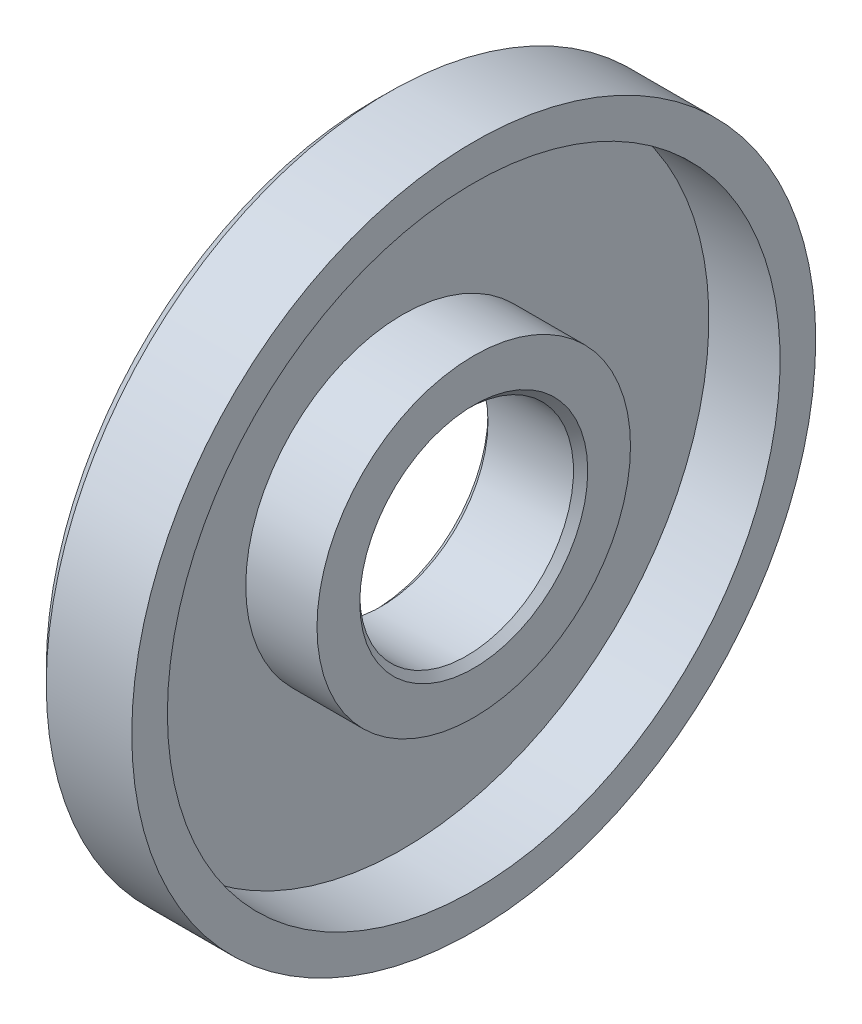
ISO-10303-21;
HEADER;
FILE_DESCRIPTION(('STEP AP214'),'2;1');
FILE_NAME('part.step','',(''),(''),'','','');
FILE_SCHEMA(('AUTOMOTIVE_DESIGN { 1 0 10303 214 1 1 1 1 }'));
ENDSEC;
DATA;
#1=APPLICATION_CONTEXT('core data for automotive mechanical design processes');
#2=APPLICATION_PROTOCOL_DEFINITION('international standard','automotive_design',2000,#1);
#3=PRODUCT_CONTEXT('',#1,'mechanical');
#4=PRODUCT('Part','Part','',(#3));
#5=PRODUCT_RELATED_PRODUCT_CATEGORY('part','',(#4));
#6=PRODUCT_DEFINITION_FORMATION('','',#4);
#7=PRODUCT_DEFINITION_CONTEXT('part definition',#1,'design');
#8=PRODUCT_DEFINITION('design','',#6,#7);
#9=PRODUCT_DEFINITION_SHAPE('','',#8);
#10=(LENGTH_UNIT() NAMED_UNIT(*) SI_UNIT(.MILLI.,.METRE.));
#11=(NAMED_UNIT(*) PLANE_ANGLE_UNIT() SI_UNIT($,.RADIAN.));
#12=(NAMED_UNIT(*) SI_UNIT($,.STERADIAN.) SOLID_ANGLE_UNIT());
#13=UNCERTAINTY_MEASURE_WITH_UNIT(LENGTH_MEASURE(1.E-05),#10,'distance_accuracy_value','');
#14=(GEOMETRIC_REPRESENTATION_CONTEXT(3) GLOBAL_UNCERTAINTY_ASSIGNED_CONTEXT((#13)) GLOBAL_UNIT_ASSIGNED_CONTEXT((#10,
#11,#12)) REPRESENTATION_CONTEXT('',''));
#15=CARTESIAN_POINT('',(0.,0.,0.));
#16=DIRECTION('',(0.,0.,1.));
#17=DIRECTION('',(1.,0.,0.));
#18=AXIS2_PLACEMENT_3D('',#15,#16,#17);
#19=CARTESIAN_POINT('',(0.,0.,0.));
#20=DIRECTION('',(-1.,0.,0.));
#21=DIRECTION('',(0.,0.,1.));
#22=AXIS2_PLACEMENT_3D('',#19,#20,#21);
#23=CYLINDRICAL_SURFACE('',#22,24.);
#24=CARTESIAN_POINT('',(0.999999999999997,0.,0.));
#25=DIRECTION('',(1.,0.,0.));
#26=DIRECTION('',(0.,0.,-1.));
#27=AXIS2_PLACEMENT_3D('',#24,#25,#26);
#28=CIRCLE('',#27,24.);
#29=CARTESIAN_POINT('',(0.999999999999997,0.,-24.));
#30=VERTEX_POINT('',#29);
#31=EDGE_CURVE('E55',#30,#30,#28,.T.);
#32=ORIENTED_EDGE('',*,*,#31,.T.);
#33=EDGE_LOOP('',(#32));
#34=FACE_BOUND('',#33,.T.);
#35=CARTESIAN_POINT('',(7.,0.,0.));
#36=DIRECTION('',(-1.,0.,0.));
#37=DIRECTION('',(0.,0.,1.));
#38=AXIS2_PLACEMENT_3D('',#35,#36,#37);
#39=CIRCLE('',#38,24.);
#40=CARTESIAN_POINT('',(7.,0.,24.));
#41=VERTEX_POINT('',#40);
#42=EDGE_CURVE('E73',#41,#41,#39,.T.);
#43=ORIENTED_EDGE('',*,*,#42,.T.);
#44=EDGE_LOOP('',(#43));
#45=FACE_BOUND('',#44,.T.);
#46=ADVANCED_FACE('F35',(#34,#45),#23,.T.);
#47=CARTESIAN_POINT('',(0.,7.5,0.));
#48=DIRECTION('',(1.,0.,0.));
#49=DIRECTION('',(0.,0.,-1.));
#50=AXIS2_PLACEMENT_3D('',#47,#48,#49);
#51=PLANE('',#50);
#52=CARTESIAN_POINT('',(0.,0.,0.));
#53=DIRECTION('',(1.,0.,0.));
#54=DIRECTION('',(0.,0.,-1.));
#55=AXIS2_PLACEMENT_3D('',#52,#53,#54);
#56=CIRCLE('',#55,8.00000000000001);
#57=CARTESIAN_POINT('',(0.,0.,-8.00000000000001));
#58=VERTEX_POINT('',#57);
#59=EDGE_CURVE('E42',#58,#58,#56,.T.);
#60=ORIENTED_EDGE('',*,*,#59,.T.);
#61=EDGE_LOOP('',(#60));
#62=FACE_BOUND('',#61,.T.);
#63=CARTESIAN_POINT('',(0.,0.,0.));
#64=DIRECTION('',(1.,0.,0.));
#65=DIRECTION('',(0.,0.,-1.));
#66=AXIS2_PLACEMENT_3D('',#63,#64,#65);
#67=CIRCLE('',#66,23.);
#68=CARTESIAN_POINT('',(0.,0.,-23.));
#69=VERTEX_POINT('',#68);
#70=EDGE_CURVE('E58',#69,#69,#67,.F.);
#71=ORIENTED_EDGE('',*,*,#70,.T.);
#72=EDGE_LOOP('',(#71));
#73=FACE_BOUND('',#72,.T.);
#74=ADVANCED_FACE('F110',(#62,#73),#51,.F.);
#75=CARTESIAN_POINT('',(0.,0.,0.));
#76=DIRECTION('',(-1.,0.,0.));
#77=DIRECTION('',(0.,0.,1.));
#78=AXIS2_PLACEMENT_3D('',#75,#76,#77);
#79=CYLINDRICAL_SURFACE('',#78,7.5);
#80=CARTESIAN_POINT('',(0.500000000000007,0.,0.));
#81=DIRECTION('',(1.,0.,0.));
#82=DIRECTION('',(0.,0.,-1.));
#83=AXIS2_PLACEMENT_3D('',#80,#81,#82);
#84=CIRCLE('',#83,7.5);
#85=CARTESIAN_POINT('',(0.500000000000007,0.,-7.5));
#86=VERTEX_POINT('',#85);
#87=EDGE_CURVE('E46',#86,#86,#84,.F.);
#88=ORIENTED_EDGE('',*,*,#87,.T.);
#89=EDGE_LOOP('',(#88));
#90=FACE_BOUND('',#89,.T.);
#91=CARTESIAN_POINT('',(6.5,0.,0.));
#92=DIRECTION('',(-1.,0.,0.));
#93=DIRECTION('',(0.,0.,1.));
#94=AXIS2_PLACEMENT_3D('',#91,#92,#93);
#95=CIRCLE('',#94,7.5);
#96=CARTESIAN_POINT('',(6.5,0.,7.5));
#97=VERTEX_POINT('',#96);
#98=EDGE_CURVE('E50',#97,#97,#95,.F.);
#99=ORIENTED_EDGE('',*,*,#98,.T.);
#100=EDGE_LOOP('',(#99));
#101=FACE_BOUND('',#100,.T.);
#102=ADVANCED_FACE('F105',(#90,#101),#79,.F.);
#103=CARTESIAN_POINT('',(7.,7.5,0.));
#104=DIRECTION('',(-1.,0.,0.));
#105=DIRECTION('',(0.,0.,1.));
#106=AXIS2_PLACEMENT_3D('',#103,#104,#105);
#107=PLANE('',#106);
#108=CARTESIAN_POINT('',(7.,0.,0.));
#109=DIRECTION('',(-1.,0.,0.));
#110=DIRECTION('',(0.,0.,1.));
#111=AXIS2_PLACEMENT_3D('',#108,#109,#110);
#112=CIRCLE('',#111,8.);
#113=CARTESIAN_POINT('',(7.,0.,8.));
#114=VERTEX_POINT('',#113);
#115=EDGE_CURVE('E10',#114,#114,#112,.T.);
#116=ORIENTED_EDGE('',*,*,#115,.T.);
#117=EDGE_LOOP('',(#116));
#118=FACE_BOUND('',#117,.T.);
#119=CARTESIAN_POINT('',(7.,0.,0.));
#120=DIRECTION('',(-1.,0.,0.));
#121=DIRECTION('',(0.,0.,1.));
#122=AXIS2_PLACEMENT_3D('',#119,#120,#121);
#123=CIRCLE('',#122,11.);
#124=CARTESIAN_POINT('',(7.,0.,11.));
#125=VERTEX_POINT('',#124);
#126=EDGE_CURVE('E61',#125,#125,#123,.T.);
#127=ORIENTED_EDGE('',*,*,#126,.F.);
#128=EDGE_LOOP('',(#127));
#129=FACE_BOUND('',#128,.T.);
#130=ADVANCED_FACE('F100',(#118,#129),#107,.F.);
#131=CARTESIAN_POINT('',(0.,0.,0.));
#132=DIRECTION('',(-1.,0.,0.));
#133=DIRECTION('',(0.,0.,1.));
#134=AXIS2_PLACEMENT_3D('',#131,#132,#133);
#135=CYLINDRICAL_SURFACE('',#134,11.);
#136=CARTESIAN_POINT('',(2.,0.,0.));
#137=DIRECTION('',(-1.,0.,0.));
#138=DIRECTION('',(0.,0.,1.));
#139=AXIS2_PLACEMENT_3D('',#136,#137,#138);
#140=CIRCLE('',#139,11.);
#141=CARTESIAN_POINT('',(2.,0.,11.));
#142=VERTEX_POINT('',#141);
#143=EDGE_CURVE('E64',#142,#142,#140,.T.);
#144=ORIENTED_EDGE('',*,*,#143,.F.);
#145=EDGE_LOOP('',(#144));
#146=FACE_BOUND('',#145,.T.);
#147=ORIENTED_EDGE('',*,*,#126,.T.);
#148=EDGE_LOOP('',(#147));
#149=FACE_BOUND('',#148,.T.);
#150=ADVANCED_FACE('F94',(#146,#149),#135,.T.);
#151=CARTESIAN_POINT('',(2.,11.,0.));
#152=DIRECTION('',(-1.,0.,0.));
#153=DIRECTION('',(0.,0.,1.));
#154=AXIS2_PLACEMENT_3D('',#151,#152,#153);
#155=PLANE('',#154);
#156=CARTESIAN_POINT('',(2.,0.,0.));
#157=DIRECTION('',(-1.,0.,0.));
#158=DIRECTION('',(0.,0.,1.));
#159=AXIS2_PLACEMENT_3D('',#156,#157,#158);
#160=CIRCLE('',#159,21.5);
#161=CARTESIAN_POINT('',(2.,0.,21.5));
#162=VERTEX_POINT('',#161);
#163=EDGE_CURVE('E67',#162,#162,#160,.T.);
#164=ORIENTED_EDGE('',*,*,#163,.F.);
#165=EDGE_LOOP('',(#164));
#166=FACE_BOUND('',#165,.T.);
#167=ORIENTED_EDGE('',*,*,#143,.T.);
#168=EDGE_LOOP('',(#167));
#169=FACE_BOUND('',#168,.T.);
#170=ADVANCED_FACE('F88',(#166,#169),#155,.F.);
#171=CARTESIAN_POINT('',(0.,0.,0.));
#172=DIRECTION('',(-1.,0.,0.));
#173=DIRECTION('',(0.,0.,1.));
#174=AXIS2_PLACEMENT_3D('',#171,#172,#173);
#175=CYLINDRICAL_SURFACE('',#174,21.5);
#176=CARTESIAN_POINT('',(7.,0.,0.));
#177=DIRECTION('',(-1.,0.,0.));
#178=DIRECTION('',(0.,0.,1.));
#179=AXIS2_PLACEMENT_3D('',#176,#177,#178);
#180=CIRCLE('',#179,21.5);
#181=CARTESIAN_POINT('',(7.,0.,21.5));
#182=VERTEX_POINT('',#181);
#183=EDGE_CURVE('E70',#182,#182,#180,.T.);
#184=ORIENTED_EDGE('',*,*,#183,.F.);
#185=EDGE_LOOP('',(#184));
#186=FACE_BOUND('',#185,.T.);
#187=ORIENTED_EDGE('',*,*,#163,.T.);
#188=EDGE_LOOP('',(#187));
#189=FACE_BOUND('',#188,.T.);
#190=ADVANCED_FACE('F82',(#186,#189),#175,.F.);
#191=CARTESIAN_POINT('',(7.,21.5,0.));
#192=DIRECTION('',(-1.,0.,0.));
#193=DIRECTION('',(0.,0.,1.));
#194=AXIS2_PLACEMENT_3D('',#191,#192,#193);
#195=PLANE('',#194);
#196=ORIENTED_EDGE('',*,*,#42,.F.);
#197=EDGE_LOOP('',(#196));
#198=FACE_BOUND('',#197,.T.);
#199=ORIENTED_EDGE('',*,*,#183,.T.);
#200=EDGE_LOOP('',(#199));
#201=FACE_BOUND('',#200,.T.);
#202=ADVANCED_FACE('F78',(#198,#201),#195,.F.);
#203=CARTESIAN_POINT('',(0.,0.,0.));
#204=DIRECTION('',(1.,0.,0.));
#205=DIRECTION('',(0.,0.,-1.));
#206=AXIS2_PLACEMENT_3D('',#203,#204,#205);
#207=CONICAL_SURFACE('',#206,23.,0.785398163397445);
#208=ORIENTED_EDGE('',*,*,#31,.F.);
#209=EDGE_LOOP('',(#208));
#210=FACE_BOUND('',#209,.T.);
#211=ORIENTED_EDGE('',*,*,#70,.F.);
#212=EDGE_LOOP('',(#211));
#213=FACE_BOUND('',#212,.T.);
#214=ADVANCED_FACE('F81',(#210,#213),#207,.T.);
#215=CARTESIAN_POINT('',(0.500000000000007,0.,0.));
#216=DIRECTION('',(-1.,0.,0.));
#217=DIRECTION('',(0.,0.,1.));
#218=AXIS2_PLACEMENT_3D('',#215,#216,#217);
#219=CONICAL_SURFACE('',#218,7.5,0.785398163397449);
#220=ORIENTED_EDGE('',*,*,#59,.F.);
#221=EDGE_LOOP('',(#220));
#222=FACE_BOUND('',#221,.T.);
#223=ORIENTED_EDGE('',*,*,#87,.F.);
#224=EDGE_LOOP('',(#223));
#225=FACE_BOUND('',#224,.T.);
#226=ADVANCED_FACE('F122',(#222,#225),#219,.F.);
#227=CARTESIAN_POINT('',(7.,0.,0.));
#228=DIRECTION('',(1.,0.,0.));
#229=DIRECTION('',(0.,0.,-1.));
#230=AXIS2_PLACEMENT_3D('',#227,#228,#229);
#231=CONICAL_SURFACE('',#230,8.,0.785398163397447);
#232=ORIENTED_EDGE('',*,*,#98,.F.);
#233=EDGE_LOOP('',(#232));
#234=FACE_BOUND('',#233,.T.);
#235=ORIENTED_EDGE('',*,*,#115,.F.);
#236=EDGE_LOOP('',(#235));
#237=FACE_BOUND('',#236,.T.);
#238=ADVANCED_FACE('F37',(#234,#237),#231,.F.);
#239=CLOSED_SHELL('',(#46,#74,#102,#130,#150,#170,#190,#202,#214,#226,#238));
#240=MANIFOLD_SOLID_BREP('B2',#239);
#241=ADVANCED_BREP_SHAPE_REPRESENTATION('',(#18,#240),#14);
#242=SHAPE_DEFINITION_REPRESENTATION(#9,#241);
ENDSEC;
END-ISO-10303-21;
